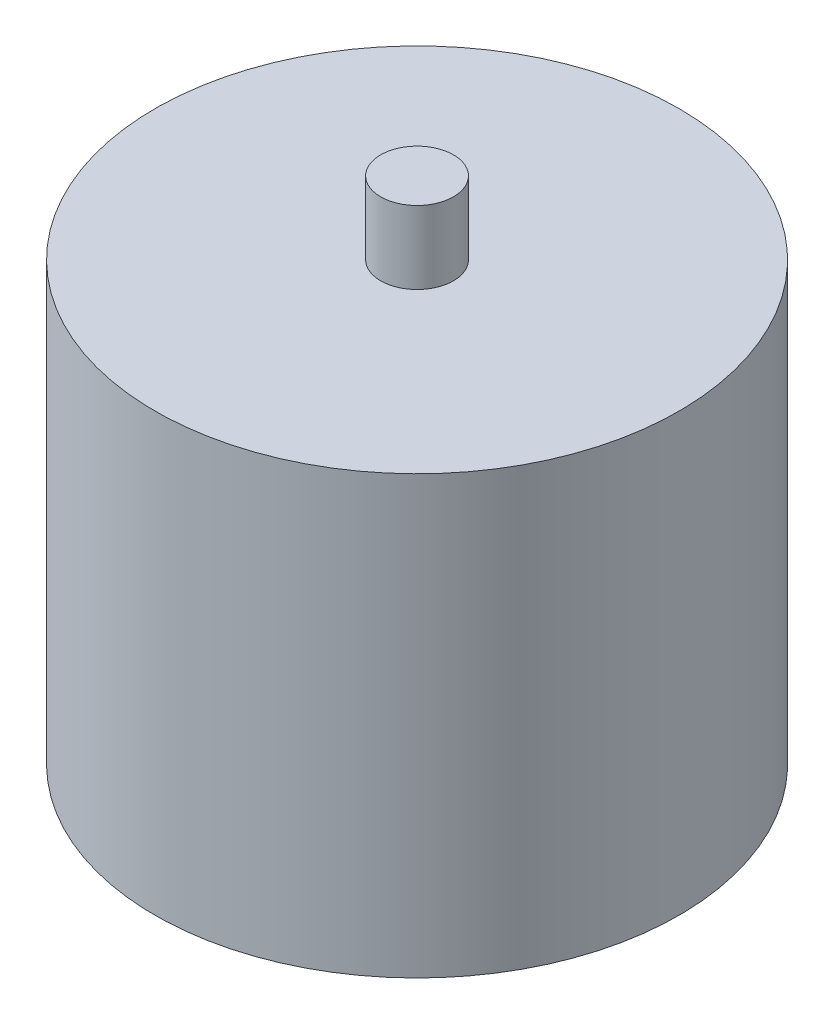
ISO-10303-21;
HEADER;
FILE_DESCRIPTION(('STEP AP214'),'2;1');
FILE_NAME('part.step','',(''),(''),'','','');
FILE_SCHEMA(('AUTOMOTIVE_DESIGN { 1 0 10303 214 1 1 1 1 }'));
ENDSEC;
DATA;
#1=APPLICATION_CONTEXT('core data for automotive mechanical design processes');
#2=APPLICATION_PROTOCOL_DEFINITION('international standard','automotive_design',2000,#1);
#3=PRODUCT_CONTEXT('',#1,'mechanical');
#4=PRODUCT('Part','Part','',(#3));
#5=PRODUCT_RELATED_PRODUCT_CATEGORY('part','',(#4));
#6=PRODUCT_DEFINITION_FORMATION('','',#4);
#7=PRODUCT_DEFINITION_CONTEXT('part definition',#1,'design');
#8=PRODUCT_DEFINITION('design','',#6,#7);
#9=PRODUCT_DEFINITION_SHAPE('','',#8);
#10=(LENGTH_UNIT() NAMED_UNIT(*) SI_UNIT(.MILLI.,.METRE.));
#11=(NAMED_UNIT(*) PLANE_ANGLE_UNIT() SI_UNIT($,.RADIAN.));
#12=(NAMED_UNIT(*) SI_UNIT($,.STERADIAN.) SOLID_ANGLE_UNIT());
#13=UNCERTAINTY_MEASURE_WITH_UNIT(LENGTH_MEASURE(1.E-05),#10,'distance_accuracy_value','');
#14=(GEOMETRIC_REPRESENTATION_CONTEXT(3) GLOBAL_UNCERTAINTY_ASSIGNED_CONTEXT((#13)) GLOBAL_UNIT_ASSIGNED_CONTEXT((#10,
#11,#12)) REPRESENTATION_CONTEXT('',''));
#15=CARTESIAN_POINT('',(0.,0.,0.));
#16=DIRECTION('',(0.,0.,1.));
#17=DIRECTION('',(1.,0.,0.));
#18=AXIS2_PLACEMENT_3D('',#15,#16,#17);
#19=CARTESIAN_POINT('',(0.,19.05,0.));
#20=DIRECTION('',(0.,1.,0.));
#21=DIRECTION('',(0.,0.,1.));
#22=AXIS2_PLACEMENT_3D('',#19,#20,#21);
#23=PLANE('',#22);
#24=CARTESIAN_POINT('',(0.,19.05,0.));
#25=DIRECTION('',(0.,1.,0.));
#26=DIRECTION('',(0.,0.,1.));
#27=AXIS2_PLACEMENT_3D('',#24,#25,#26);
#28=CIRCLE('',#27,11.43);
#29=CARTESIAN_POINT('',(0.,19.05,-11.43));
#30=VERTEX_POINT('',#29);
#31=EDGE_CURVE('E10',#30,#30,#28,.T.);
#32=ORIENTED_EDGE('',*,*,#31,.T.);
#33=EDGE_LOOP('',(#32));
#34=FACE_BOUND('',#33,.T.);
#35=CARTESIAN_POINT('',(0.,19.05,0.));
#36=DIRECTION('',(0.,1.,0.));
#37=DIRECTION('',(0.,0.,1.));
#38=AXIS2_PLACEMENT_3D('',#35,#36,#37);
#39=CIRCLE('',#38,1.5875);
#40=CARTESIAN_POINT('',(0.,19.05,1.5875));
#41=VERTEX_POINT('',#40);
#42=EDGE_CURVE('E44',#41,#41,#39,.T.);
#43=ORIENTED_EDGE('',*,*,#42,.F.);
#44=EDGE_LOOP('',(#43));
#45=FACE_BOUND('',#44,.T.);
#46=ADVANCED_FACE('F31',(#34,#45),#23,.T.);
#47=CARTESIAN_POINT('',(0.,19.05,0.));
#48=DIRECTION('',(0.,-1.,0.));
#49=DIRECTION('',(0.,0.,-1.));
#50=AXIS2_PLACEMENT_3D('',#47,#48,#49);
#51=CYLINDRICAL_SURFACE('',#50,11.43);
#52=CARTESIAN_POINT('',(0.,0.,0.));
#53=DIRECTION('',(0.,1.,0.));
#54=DIRECTION('',(0.,0.,1.));
#55=AXIS2_PLACEMENT_3D('',#52,#53,#54);
#56=CIRCLE('',#55,11.43);
#57=CARTESIAN_POINT('',(0.,0.,-11.43));
#58=VERTEX_POINT('',#57);
#59=EDGE_CURVE('E35',#58,#58,#56,.T.);
#60=CARTESIAN_POINT('',(0.,19.05,-11.43));
#61=CARTESIAN_POINT('',(0.,18.8515625,-11.43));
#62=CARTESIAN_POINT('',(0.,18.653125,-11.43));
#63=CARTESIAN_POINT('',(0.,18.25625,-11.43));
#64=CARTESIAN_POINT('',(0.,18.0578125,-11.43));
#65=CARTESIAN_POINT('',(0.,17.6609375,-11.43));
#66=CARTESIAN_POINT('',(0.,17.4625,-11.43));
#67=CARTESIAN_POINT('',(0.,17.065625,-11.43));
#68=CARTESIAN_POINT('',(0.,16.8671875,-11.43));
#69=CARTESIAN_POINT('',(0.,16.4703125,-11.43));
#70=CARTESIAN_POINT('',(0.,16.271875,-11.43));
#71=CARTESIAN_POINT('',(0.,15.875,-11.43));
#72=CARTESIAN_POINT('',(0.,15.6765625,-11.43));
#73=CARTESIAN_POINT('',(0.,15.2796875,-11.43));
#74=CARTESIAN_POINT('',(0.,15.08125,-11.43));
#75=CARTESIAN_POINT('',(0.,14.684375,-11.43));
#76=CARTESIAN_POINT('',(0.,14.4859375,-11.43));
#77=CARTESIAN_POINT('',(0.,14.0890625,-11.43));
#78=CARTESIAN_POINT('',(0.,13.890625,-11.43));
#79=CARTESIAN_POINT('',(0.,13.49375,-11.43));
#80=CARTESIAN_POINT('',(0.,13.2953125,-11.43));
#81=CARTESIAN_POINT('',(0.,12.8984375,-11.43));
#82=CARTESIAN_POINT('',(0.,12.7,-11.43));
#83=CARTESIAN_POINT('',(0.,12.303125,-11.43));
#84=CARTESIAN_POINT('',(0.,12.1046875,-11.43));
#85=CARTESIAN_POINT('',(0.,11.7078125,-11.43));
#86=CARTESIAN_POINT('',(0.,11.509375,-11.43));
#87=CARTESIAN_POINT('',(0.,11.1125,-11.43));
#88=CARTESIAN_POINT('',(0.,10.9140625,-11.43));
#89=CARTESIAN_POINT('',(0.,10.5171875,-11.43));
#90=CARTESIAN_POINT('',(0.,10.31875,-11.43));
#91=CARTESIAN_POINT('',(0.,9.921875,-11.43));
#92=CARTESIAN_POINT('',(0.,9.7234375,-11.43));
#93=CARTESIAN_POINT('',(0.,9.3265625,-11.43));
#94=CARTESIAN_POINT('',(0.,9.128125,-11.43));
#95=CARTESIAN_POINT('',(0.,8.73125,-11.43));
#96=CARTESIAN_POINT('',(0.,8.5328125,-11.43));
#97=CARTESIAN_POINT('',(0.,8.1359375,-11.43));
#98=CARTESIAN_POINT('',(0.,7.9375,-11.43));
#99=CARTESIAN_POINT('',(0.,7.540625,-11.43));
#100=CARTESIAN_POINT('',(0.,7.3421875,-11.43));
#101=CARTESIAN_POINT('',(0.,6.9453125,-11.43));
#102=CARTESIAN_POINT('',(0.,6.746875,-11.43));
#103=CARTESIAN_POINT('',(0.,6.35,-11.43));
#104=CARTESIAN_POINT('',(0.,6.1515625,-11.43));
#105=CARTESIAN_POINT('',(0.,5.7546875,-11.43));
#106=CARTESIAN_POINT('',(0.,5.55625,-11.43));
#107=CARTESIAN_POINT('',(0.,5.159375,-11.43));
#108=CARTESIAN_POINT('',(0.,4.9609375,-11.43));
#109=CARTESIAN_POINT('',(0.,4.5640625,-11.43));
#110=CARTESIAN_POINT('',(0.,4.365625,-11.43));
#111=CARTESIAN_POINT('',(0.,3.96875,-11.43));
#112=CARTESIAN_POINT('',(0.,3.7703125,-11.43));
#113=CARTESIAN_POINT('',(0.,3.3734375,-11.43));
#114=CARTESIAN_POINT('',(0.,3.175,-11.43));
#115=CARTESIAN_POINT('',(0.,2.778125,-11.43));
#116=CARTESIAN_POINT('',(0.,2.5796875,-11.43));
#117=CARTESIAN_POINT('',(0.,2.1828125,-11.43));
#118=CARTESIAN_POINT('',(0.,1.984375,-11.43));
#119=CARTESIAN_POINT('',(0.,1.5875,-11.43));
#120=CARTESIAN_POINT('',(0.,1.3890625,-11.43));
#121=CARTESIAN_POINT('',(0.,0.992187500000001,-11.43));
#122=CARTESIAN_POINT('',(0.,0.793750000000001,-11.43));
#123=CARTESIAN_POINT('',(0.,0.396875,-11.43));
#124=CARTESIAN_POINT('',(0.,0.1984375,-11.43));
#125=CARTESIAN_POINT('',(0.,0.,-11.43));
#126=B_SPLINE_CURVE_WITH_KNOTS('',3,(#60,#61,#62,#63,#64,#65,#66,#67,#68,#69,#70,#71,#72,#73,
#74,#75,#76,#77,#78,#79,#80,#81,#82,#83,#84,#85,#86,#87,#88,#89,#90,#91,#92,#93,#94,#95,#96,#97,
#98,#99,#100,#101,#102,#103,#104,#105,#106,#107,#108,#109,#110,#111,#112,#113,#114,#115,#116,
#117,#118,#119,#120,#121,#122,#123,#124,#125),.UNSPECIFIED.,.F.,.F.,(4,2,2,2,2,2,2,2,2,2,2,2,2,
2,2,2,2,2,2,2,2,2,2,2,2,2,2,2,2,2,2,2,4),(0.,0.595312499999997,1.190625,1.7859375,2.38125,
2.9765625,3.571875,4.1671875,4.7625,5.3578125,5.953125,6.5484375,7.14375,7.7390625,8.334375,
8.9296875,9.525,10.1203125,10.715625,11.3109375,11.90625,12.5015625,13.096875,13.6921875,
14.2875,14.8828125,15.478125,16.0734375,16.66875,17.2640625,17.859375,18.4546875,19.05),.UNSPECIFIED.);
#127=EDGE_CURVE('BSEAM33',#30,#58,#126,.T.);
#128=ORIENTED_EDGE('',*,*,#31,.F.);
#129=ORIENTED_EDGE('',*,*,#59,.T.);
#130=ORIENTED_EDGE('',*,*,#127,.T.);
#131=ORIENTED_EDGE('',*,*,#127,.F.);
#132=EDGE_LOOP('',(#128,#130,#129,#131));
#133=FACE_BOUND('',#132,.T.);
#134=ADVANCED_FACE('F33',(#133),#51,.T.);
#135=CARTESIAN_POINT('',(0.,0.,0.));
#136=DIRECTION('',(0.,1.,0.));
#137=DIRECTION('',(0.,0.,1.));
#138=AXIS2_PLACEMENT_3D('',#135,#136,#137);
#139=PLANE('',#138);
#140=ORIENTED_EDGE('',*,*,#59,.F.);
#141=EDGE_LOOP('',(#140));
#142=FACE_BOUND('',#141,.T.);
#143=ADVANCED_FACE('F55',(#142),#139,.F.);
#144=CARTESIAN_POINT('',(0.,22.225,0.));
#145=DIRECTION('',(0.,-1.,0.));
#146=DIRECTION('',(0.,0.,-1.));
#147=AXIS2_PLACEMENT_3D('',#144,#145,#146);
#148=CYLINDRICAL_SURFACE('',#147,1.5875);
#149=CARTESIAN_POINT('',(0.,22.225,0.));
#150=DIRECTION('',(0.,1.,0.));
#151=DIRECTION('',(0.,0.,1.));
#152=AXIS2_PLACEMENT_3D('',#149,#150,#151);
#153=CIRCLE('',#152,1.5875);
#154=CARTESIAN_POINT('',(0.,22.225,1.5875));
#155=VERTEX_POINT('',#154);
#156=EDGE_CURVE('E42',#155,#155,#153,.T.);
#157=ORIENTED_EDGE('',*,*,#156,.F.);
#158=EDGE_LOOP('',(#157));
#159=FACE_BOUND('',#158,.T.);
#160=ORIENTED_EDGE('',*,*,#42,.T.);
#161=EDGE_LOOP('',(#160));
#162=FACE_BOUND('',#161,.T.);
#163=ADVANCED_FACE('F52',(#159,#162),#148,.T.);
#164=CARTESIAN_POINT('',(0.,22.225,0.));
#165=DIRECTION('',(0.,1.,0.));
#166=DIRECTION('',(0.,0.,1.));
#167=AXIS2_PLACEMENT_3D('',#164,#165,#166);
#168=PLANE('',#167);
#169=ORIENTED_EDGE('',*,*,#156,.T.);
#170=EDGE_LOOP('',(#169));
#171=FACE_BOUND('',#170,.T.);
#172=ADVANCED_FACE('F50',(#171),#168,.T.);
#173=CLOSED_SHELL('',(#46,#134,#143,#163,#172));
#174=MANIFOLD_SOLID_BREP('B2',#173);
#175=ADVANCED_BREP_SHAPE_REPRESENTATION('',(#18,#174),#14);
#176=SHAPE_DEFINITION_REPRESENTATION(#9,#175);
ENDSEC;
END-ISO-10303-21;
